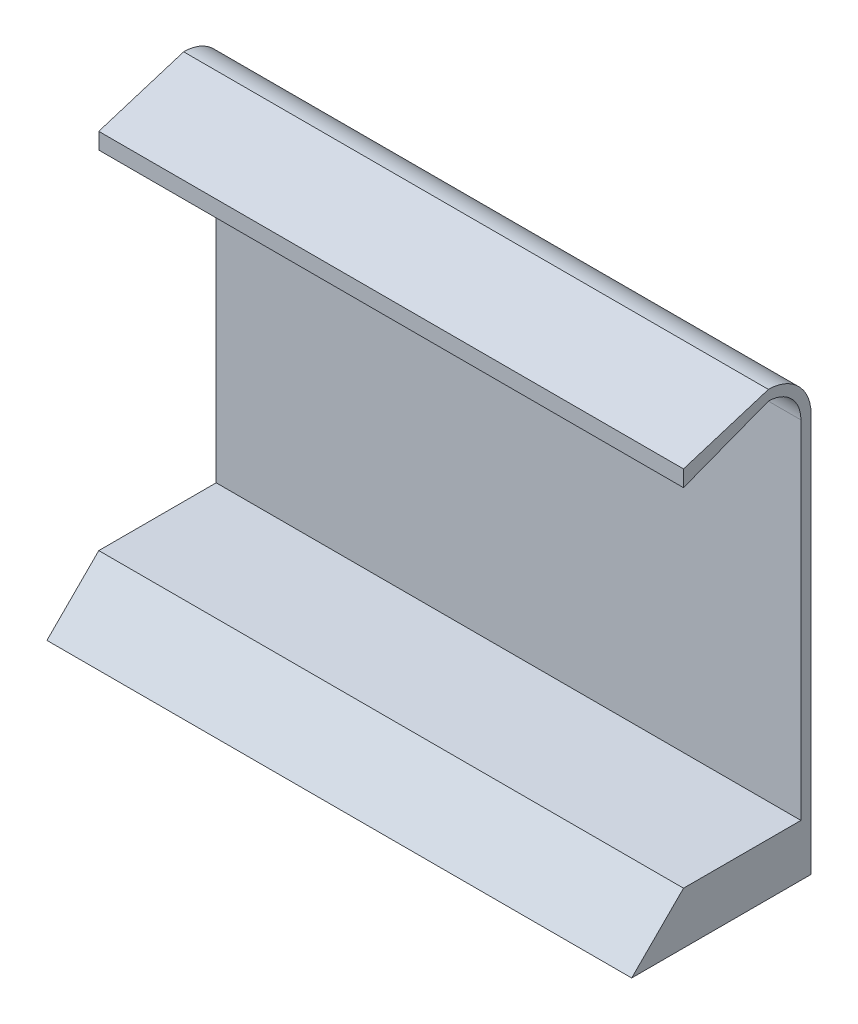
ISO-10303-21;
HEADER;
FILE_DESCRIPTION(('STEP AP214'),'2;1');
FILE_NAME('part.step','',(''),(''),'','','');
FILE_SCHEMA(('AUTOMOTIVE_DESIGN { 1 0 10303 214 1 1 1 1 }'));
ENDSEC;
DATA;
#1=APPLICATION_CONTEXT('core data for automotive mechanical design processes');
#2=APPLICATION_PROTOCOL_DEFINITION('international standard','automotive_design',2000,#1);
#3=PRODUCT_CONTEXT('',#1,'mechanical');
#4=PRODUCT('Part','Part','',(#3));
#5=PRODUCT_RELATED_PRODUCT_CATEGORY('part','',(#4));
#6=PRODUCT_DEFINITION_FORMATION('','',#4);
#7=PRODUCT_DEFINITION_CONTEXT('part definition',#1,'design');
#8=PRODUCT_DEFINITION('design','',#6,#7);
#9=PRODUCT_DEFINITION_SHAPE('','',#8);
#10=(LENGTH_UNIT() NAMED_UNIT(*) SI_UNIT(.MILLI.,.METRE.));
#11=(NAMED_UNIT(*) PLANE_ANGLE_UNIT() SI_UNIT($,.RADIAN.));
#12=(NAMED_UNIT(*) SI_UNIT($,.STERADIAN.) SOLID_ANGLE_UNIT());
#13=UNCERTAINTY_MEASURE_WITH_UNIT(LENGTH_MEASURE(1.E-05),#10,'distance_accuracy_value','');
#14=(GEOMETRIC_REPRESENTATION_CONTEXT(3) GLOBAL_UNCERTAINTY_ASSIGNED_CONTEXT((#13)) GLOBAL_UNIT_ASSIGNED_CONTEXT((#10,
#11,#12)) REPRESENTATION_CONTEXT('',''));
#15=CARTESIAN_POINT('',(0.,0.,0.));
#16=DIRECTION('',(0.,0.,1.));
#17=DIRECTION('',(1.,0.,0.));
#18=AXIS2_PLACEMENT_3D('',#15,#16,#17);
#19=CARTESIAN_POINT('',(558.8,-315.218136756144,1.01656511048225E-13));
#20=DIRECTION('',(0.,-1.,0.));
#21=DIRECTION('',(0.,0.,-1.));
#22=AXIS2_PLACEMENT_3D('',#19,#20,#21);
#23=PLANE('',#22);
#24=DIRECTION('',(0.,0.,1.));
#25=VECTOR('',#24,1.);
#26=CARTESIAN_POINT('',(0.,-315.218136756144,1.01656511048225E-13));
#27=LINE('',#26,#25);
#28=CARTESIAN_POINT('',(0.,-315.218136756144,1.01656511048225E-13));
#29=VERTEX_POINT('',#28);
#30=CARTESIAN_POINT('',(0.,-315.218136756144,112.188138153515));
#31=VERTEX_POINT('',#30);
#32=EDGE_CURVE('E141',#29,#31,#27,.T.);
#33=ORIENTED_EDGE('',*,*,#32,.T.);
#34=DIRECTION('',(-1.,0.,0.));
#35=VECTOR('',#34,1.);
#36=CARTESIAN_POINT('',(558.8,-315.218136756144,112.188138153515));
#37=LINE('',#36,#35);
#38=CARTESIAN_POINT('',(558.8,-315.218136756144,112.188138153515));
#39=VERTEX_POINT('',#38);
#40=EDGE_CURVE('E11',#39,#31,#37,.T.);
#41=ORIENTED_EDGE('',*,*,#40,.F.);
#42=DIRECTION('',(0.,0.,1.));
#43=VECTOR('',#42,1.);
#44=CARTESIAN_POINT('',(558.8,-315.218136756144,1.01656511048225E-13));
#45=LINE('',#44,#43);
#46=CARTESIAN_POINT('',(558.8,-315.218136756144,1.01656511048225E-13));
#47=VERTEX_POINT('',#46);
#48=EDGE_CURVE('E160',#47,#39,#45,.T.);
#49=ORIENTED_EDGE('',*,*,#48,.F.);
#50=DIRECTION('',(-1.,0.,0.));
#51=VECTOR('',#50,1.);
#52=CARTESIAN_POINT('',(558.8,-315.218136756144,1.01656511048225E-13));
#53=LINE('',#52,#51);
#54=EDGE_CURVE('E137',#47,#29,#53,.T.);
#55=ORIENTED_EDGE('',*,*,#54,.T.);
#56=EDGE_LOOP('',(#33,#41,#49,#55));
#57=FACE_BOUND('',#56,.T.);
#58=ADVANCED_FACE('F33',(#57),#23,.F.);
#59=CARTESIAN_POINT('',(558.8,-315.218136756144,112.188138153515));
#60=DIRECTION('',(0.,-0.707106781186548,-0.707106781186548));
#61=DIRECTION('',(0.,0.707106781186548,-0.707106781186548));
#62=AXIS2_PLACEMENT_3D('',#59,#60,#61);
#63=PLANE('',#62);
#64=DIRECTION('',(0.,-0.707106781186547,0.707106781186547));
#65=VECTOR('',#64,1.);
#66=CARTESIAN_POINT('',(0.,-315.218136756144,112.188138153515));
#67=LINE('',#66,#65);
#68=CARTESIAN_POINT('',(0.,-364.768987416644,161.738988814015));
#69=VERTEX_POINT('',#68);
#70=EDGE_CURVE('E144',#31,#69,#67,.T.);
#71=ORIENTED_EDGE('',*,*,#70,.T.);
#72=DIRECTION('',(-1.,0.,0.));
#73=VECTOR('',#72,1.);
#74=CARTESIAN_POINT('',(558.8,-364.768987416644,161.738988814015));
#75=LINE('',#74,#73);
#76=CARTESIAN_POINT('',(558.8,-364.768987416644,161.738988814015));
#77=VERTEX_POINT('',#76);
#78=EDGE_CURVE('E41',#77,#69,#75,.T.);
#79=ORIENTED_EDGE('',*,*,#78,.F.);
#80=DIRECTION('',(0.,-0.707106781186547,0.707106781186547));
#81=VECTOR('',#80,1.);
#82=CARTESIAN_POINT('',(558.8,-315.218136756144,112.188138153515));
#83=LINE('',#82,#81);
#84=EDGE_CURVE('E98',#39,#77,#83,.T.);
#85=ORIENTED_EDGE('',*,*,#84,.F.);
#86=ORIENTED_EDGE('',*,*,#40,.T.);
#87=EDGE_LOOP('',(#71,#79,#85,#86));
#88=FACE_BOUND('',#87,.T.);
#89=ADVANCED_FACE('F181',(#88),#63,.F.);
#90=CARTESIAN_POINT('',(558.8,-364.768987416644,1.32675666207716E-13));
#91=DIRECTION('',(0.,1.,0.));
#92=DIRECTION('',(0.,0.,1.));
#93=AXIS2_PLACEMENT_3D('',#90,#91,#92);
#94=PLANE('',#93);
#95=DIRECTION('',(0.,0.,-1.));
#96=VECTOR('',#95,1.);
#97=CARTESIAN_POINT('',(0.,-364.768987416644,1.32675666207716E-13));
#98=LINE('',#97,#96);
#99=CARTESIAN_POINT('',(0.,-364.768987416644,-9.7108622293583));
#100=VERTEX_POINT('',#99);
#101=EDGE_CURVE('E147',#69,#100,#98,.T.);
#102=ORIENTED_EDGE('',*,*,#101,.T.);
#103=DIRECTION('',(-1.,0.,0.));
#104=VECTOR('',#103,1.);
#105=CARTESIAN_POINT('',(558.8,-364.768987416644,-9.7108622293583));
#106=LINE('',#105,#104);
#107=CARTESIAN_POINT('',(558.8,-364.768987416644,-9.7108622293583));
#108=VERTEX_POINT('',#107);
#109=EDGE_CURVE('E173',#108,#100,#106,.T.);
#110=ORIENTED_EDGE('',*,*,#109,.F.);
#111=DIRECTION('',(0.,0.,-1.));
#112=VECTOR('',#111,1.);
#113=CARTESIAN_POINT('',(558.8,-364.768987416644,161.738988814015));
#114=LINE('',#113,#112);
#115=EDGE_CURVE('E180',#77,#108,#114,.T.);
#116=ORIENTED_EDGE('',*,*,#115,.F.);
#117=ORIENTED_EDGE('',*,*,#78,.T.);
#118=EDGE_LOOP('',(#102,#110,#116,#117));
#119=FACE_BOUND('',#118,.T.);
#120=ADVANCED_FACE('F178',(#119),#94,.F.);
#121=CARTESIAN_POINT('',(558.8,-364.768987416644,-9.7108622293583));
#122=DIRECTION('',(0.,0.,1.));
#123=DIRECTION('',(0.,-1.,0.));
#124=AXIS2_PLACEMENT_3D('',#121,#122,#123);
#125=PLANE('',#124);
#126=DIRECTION('',(0.,1.,0.));
#127=VECTOR('',#126,1.);
#128=CARTESIAN_POINT('',(0.,-364.768987416644,-9.7108622293583));
#129=LINE('',#128,#127);
#130=CARTESIAN_POINT('',(0.,16.2310125833563,-9.71086222935846));
#131=VERTEX_POINT('',#130);
#132=EDGE_CURVE('E149',#100,#131,#129,.T.);
#133=ORIENTED_EDGE('',*,*,#132,.T.);
#134=DIRECTION('',(-1.,0.,0.));
#135=VECTOR('',#134,1.);
#136=CARTESIAN_POINT('',(558.8,16.2310125833563,-9.71086222935846));
#137=LINE('',#136,#135);
#138=CARTESIAN_POINT('',(558.8,16.2310125833563,-9.71086222935846));
#139=VERTEX_POINT('',#138);
#140=EDGE_CURVE('E170',#139,#131,#137,.T.);
#141=ORIENTED_EDGE('',*,*,#140,.F.);
#142=DIRECTION('',(0.,1.,0.));
#143=VECTOR('',#142,1.);
#144=CARTESIAN_POINT('',(558.8,-364.768987416644,-9.7108622293583));
#145=LINE('',#144,#143);
#146=EDGE_CURVE('E200',#108,#139,#145,.T.);
#147=ORIENTED_EDGE('',*,*,#146,.F.);
#148=ORIENTED_EDGE('',*,*,#109,.T.);
#149=EDGE_LOOP('',(#133,#141,#147,#148));
#150=FACE_BOUND('',#149,.T.);
#151=ADVANCED_FACE('F191',(#150),#125,.F.);
#152=CARTESIAN_POINT('',(558.8,16.2310125833563,31.074759133947));
#153=DIRECTION('',(-1.,0.,0.));
#154=DIRECTION('',(0.,0.,1.));
#155=AXIS2_PLACEMENT_3D('',#152,#153,#154);
#156=CYLINDRICAL_SURFACE('',#155,40.7856213633055);
#157=CARTESIAN_POINT('',(0.,16.2310125833563,31.074759133947));
#158=DIRECTION('',(1.,0.,0.));
#159=DIRECTION('',(0.,0.,-1.));
#160=AXIS2_PLACEMENT_3D('',#157,#158,#159);
#161=CIRCLE('',#160,40.7856213633055);
#162=CARTESIAN_POINT('',(0.,57.0166339466617,31.0747591339472));
#163=VERTEX_POINT('',#162);
#164=EDGE_CURVE('E151',#131,#163,#161,.T.);
#165=ORIENTED_EDGE('',*,*,#164,.T.);
#166=DIRECTION('',(-1.,0.,0.));
#167=VECTOR('',#166,1.);
#168=CARTESIAN_POINT('',(558.8,57.0166339466617,31.0747591339472));
#169=LINE('',#168,#167);
#170=CARTESIAN_POINT('',(558.8,57.0166339466617,31.0747591339472));
#171=VERTEX_POINT('',#170);
#172=EDGE_CURVE('E167',#171,#163,#169,.T.);
#173=ORIENTED_EDGE('',*,*,#172,.F.);
#174=CARTESIAN_POINT('',(558.8,16.2310125833563,31.074759133947));
#175=DIRECTION('',(1.,0.,0.));
#176=DIRECTION('',(0.,0.,-1.));
#177=AXIS2_PLACEMENT_3D('',#174,#175,#176);
#178=CIRCLE('',#177,40.7856213633055);
#179=EDGE_CURVE('E197',#139,#171,#178,.T.);
#180=ORIENTED_EDGE('',*,*,#179,.F.);
#181=ORIENTED_EDGE('',*,*,#140,.T.);
#182=EDGE_LOOP('',(#165,#173,#180,#181));
#183=FACE_BOUND('',#182,.T.);
#184=ADVANCED_FACE('F195',(#183),#156,.T.);
#185=CARTESIAN_POINT('',(558.8,31.76839215033,112.188138153515));
#186=DIRECTION('',(0.,-0.954813464793643,-0.29720573253011));
#187=DIRECTION('',(0.,0.29720573253011,-0.954813464793643));
#188=AXIS2_PLACEMENT_3D('',#185,#186,#187);
#189=PLANE('',#188);
#190=DIRECTION('',(0.,-0.29720573253011,0.954813464793643));
#191=VECTOR('',#190,1.);
#192=CARTESIAN_POINT('',(0.,31.76839215033,112.188138153515));
#193=LINE('',#192,#191);
#194=CARTESIAN_POINT('',(0.,31.76839215033,112.188138153515));
#195=VERTEX_POINT('',#194);
#196=EDGE_CURVE('E153',#163,#195,#193,.T.);
#197=ORIENTED_EDGE('',*,*,#196,.T.);
#198=DIRECTION('',(-1.,0.,0.));
#199=VECTOR('',#198,1.);
#200=CARTESIAN_POINT('',(558.8,31.76839215033,112.188138153515));
#201=LINE('',#200,#199);
#202=CARTESIAN_POINT('',(558.8,31.76839215033,112.188138153515));
#203=VERTEX_POINT('',#202);
#204=EDGE_CURVE('E164',#203,#195,#201,.T.);
#205=ORIENTED_EDGE('',*,*,#204,.F.);
#206=DIRECTION('',(0.,-0.29720573253011,0.954813464793643));
#207=VECTOR('',#206,1.);
#208=CARTESIAN_POINT('',(558.8,31.76839215033,112.188138153515));
#209=LINE('',#208,#207);
#210=EDGE_CURVE('E199',#171,#203,#209,.T.);
#211=ORIENTED_EDGE('',*,*,#210,.F.);
#212=ORIENTED_EDGE('',*,*,#172,.T.);
#213=EDGE_LOOP('',(#197,#205,#211,#212));
#214=FACE_BOUND('',#213,.T.);
#215=ADVANCED_FACE('F215',(#214),#189,.F.);
#216=CARTESIAN_POINT('',(558.8,16.2310125833563,112.188138153515));
#217=DIRECTION('',(0.,0.,-1.));
#218=DIRECTION('',(0.,1.,0.));
#219=AXIS2_PLACEMENT_3D('',#216,#217,#218);
#220=PLANE('',#219);
#221=DIRECTION('',(0.,-1.,0.));
#222=VECTOR('',#221,1.);
#223=CARTESIAN_POINT('',(0.,16.2310125833563,112.188138153515));
#224=LINE('',#223,#222);
#225=CARTESIAN_POINT('',(0.,16.2310125833563,112.188138153515));
#226=VERTEX_POINT('',#225);
#227=EDGE_CURVE('E155',#195,#226,#224,.T.);
#228=ORIENTED_EDGE('',*,*,#227,.T.);
#229=DIRECTION('',(-1.,0.,0.));
#230=VECTOR('',#229,1.);
#231=CARTESIAN_POINT('',(558.8,16.2310125833563,112.188138153515));
#232=LINE('',#231,#230);
#233=CARTESIAN_POINT('',(558.8,16.2310125833563,112.188138153515));
#234=VERTEX_POINT('',#233);
#235=EDGE_CURVE('E132',#234,#226,#232,.T.);
#236=ORIENTED_EDGE('',*,*,#235,.F.);
#237=DIRECTION('',(0.,-1.,0.));
#238=VECTOR('',#237,1.);
#239=CARTESIAN_POINT('',(558.8,16.2310125833563,112.188138153515));
#240=LINE('',#239,#238);
#241=EDGE_CURVE('E123',#203,#234,#240,.T.);
#242=ORIENTED_EDGE('',*,*,#241,.F.);
#243=ORIENTED_EDGE('',*,*,#204,.T.);
#244=EDGE_LOOP('',(#228,#236,#242,#243));
#245=FACE_BOUND('',#244,.T.);
#246=ADVANCED_FACE('F212',(#245),#220,.F.);
#247=CARTESIAN_POINT('',(558.8,47.3057717173033,31.0747591339471));
#248=DIRECTION('',(0.,0.933818061744606,0.357748274013372));
#249=DIRECTION('',(0.,-0.357748274013372,0.933818061744606));
#250=AXIS2_PLACEMENT_3D('',#247,#248,#249);
#251=PLANE('',#250);
#252=DIRECTION('',(0.,0.357748274013372,-0.933818061744606));
#253=VECTOR('',#252,1.);
#254=CARTESIAN_POINT('',(0.,47.3057717173033,31.0747591339471));
#255=LINE('',#254,#253);
#256=CARTESIAN_POINT('',(0.,47.3057717173033,31.0747591339471));
#257=VERTEX_POINT('',#256);
#258=EDGE_CURVE('E131',#226,#257,#255,.T.);
#259=ORIENTED_EDGE('',*,*,#258,.T.);
#260=DIRECTION('',(-1.,0.,0.));
#261=VECTOR('',#260,1.);
#262=CARTESIAN_POINT('',(558.8,47.3057717173033,31.0747591339471));
#263=LINE('',#262,#261);
#264=CARTESIAN_POINT('',(558.8,47.3057717173033,31.0747591339471));
#265=VERTEX_POINT('',#264);
#266=EDGE_CURVE('E128',#265,#257,#263,.T.);
#267=ORIENTED_EDGE('',*,*,#266,.F.);
#268=DIRECTION('',(0.,0.357748274013372,-0.933818061744606));
#269=VECTOR('',#268,1.);
#270=CARTESIAN_POINT('',(558.8,47.3057717173033,31.0747591339471));
#271=LINE('',#270,#269);
#272=EDGE_CURVE('E117',#234,#265,#271,.T.);
#273=ORIENTED_EDGE('',*,*,#272,.F.);
#274=ORIENTED_EDGE('',*,*,#235,.T.);
#275=EDGE_LOOP('',(#259,#267,#273,#274));
#276=FACE_BOUND('',#275,.T.);
#277=ADVANCED_FACE('F129',(#276),#251,.F.);
#278=CARTESIAN_POINT('',(558.8,16.2310125833563,31.074759133947));
#279=DIRECTION('',(-1.,0.,0.));
#280=DIRECTION('',(0.,0.,1.));
#281=AXIS2_PLACEMENT_3D('',#278,#279,#280);
#282=CYLINDRICAL_SURFACE('',#281,31.074759133947);
#283=CARTESIAN_POINT('',(0.,16.2310125833563,31.074759133947));
#284=DIRECTION('',(-1.,0.,0.));
#285=DIRECTION('',(0.,0.,-1.));
#286=AXIS2_PLACEMENT_3D('',#283,#284,#285);
#287=CIRCLE('',#286,31.074759133947);
#288=CARTESIAN_POINT('',(0.,16.2310125833563,0.));
#289=VERTEX_POINT('',#288);
#290=EDGE_CURVE('E84',#257,#289,#287,.T.);
#291=ORIENTED_EDGE('',*,*,#290,.T.);
#292=DIRECTION('',(-1.,0.,0.));
#293=VECTOR('',#292,1.);
#294=CARTESIAN_POINT('',(558.8,16.2310125833563,0.));
#295=LINE('',#294,#293);
#296=CARTESIAN_POINT('',(558.8,16.2310125833563,0.));
#297=VERTEX_POINT('',#296);
#298=EDGE_CURVE('E133',#297,#289,#295,.T.);
#299=ORIENTED_EDGE('',*,*,#298,.F.);
#300=CARTESIAN_POINT('',(558.8,16.2310125833563,31.074759133947));
#301=DIRECTION('',(-1.,0.,0.));
#302=DIRECTION('',(0.,0.,-1.));
#303=AXIS2_PLACEMENT_3D('',#300,#301,#302);
#304=CIRCLE('',#303,31.074759133947);
#305=EDGE_CURVE('E121',#265,#297,#304,.T.);
#306=ORIENTED_EDGE('',*,*,#305,.F.);
#307=ORIENTED_EDGE('',*,*,#266,.T.);
#308=EDGE_LOOP('',(#291,#299,#306,#307));
#309=FACE_BOUND('',#308,.T.);
#310=ADVANCED_FACE('F135',(#309),#282,.F.);
#311=CARTESIAN_POINT('',(558.8,16.2310125833563,0.));
#312=DIRECTION('',(0.,0.,-1.));
#313=DIRECTION('',(0.,1.,0.));
#314=AXIS2_PLACEMENT_3D('',#311,#312,#313);
#315=PLANE('',#314);
#316=DIRECTION('',(0.,-1.,0.));
#317=VECTOR('',#316,1.);
#318=CARTESIAN_POINT('',(0.,16.2310125833563,0.));
#319=LINE('',#318,#317);
#320=EDGE_CURVE('E90',#289,#29,#319,.T.);
#321=ORIENTED_EDGE('',*,*,#320,.T.);
#322=ORIENTED_EDGE('',*,*,#54,.F.);
#323=DIRECTION('',(0.,-1.,0.));
#324=VECTOR('',#323,1.);
#325=CARTESIAN_POINT('',(558.8,16.2310125833563,0.));
#326=LINE('',#325,#324);
#327=EDGE_CURVE('E49',#297,#47,#326,.T.);
#328=ORIENTED_EDGE('',*,*,#327,.F.);
#329=ORIENTED_EDGE('',*,*,#298,.T.);
#330=EDGE_LOOP('',(#321,#322,#328,#329));
#331=FACE_BOUND('',#330,.T.);
#332=ADVANCED_FACE('F209',(#331),#315,.F.);
#333=CARTESIAN_POINT('',(558.8,16.2310125833563,31.074759133947));
#334=DIRECTION('',(1.,0.,0.));
#335=DIRECTION('',(0.,0.,-1.));
#336=AXIS2_PLACEMENT_3D('',#333,#334,#335);
#337=PLANE('',#336);
#338=ORIENTED_EDGE('',*,*,#48,.T.);
#339=ORIENTED_EDGE('',*,*,#84,.T.);
#340=ORIENTED_EDGE('',*,*,#115,.T.);
#341=ORIENTED_EDGE('',*,*,#146,.T.);
#342=ORIENTED_EDGE('',*,*,#179,.T.);
#343=ORIENTED_EDGE('',*,*,#210,.T.);
#344=ORIENTED_EDGE('',*,*,#241,.T.);
#345=ORIENTED_EDGE('',*,*,#272,.T.);
#346=ORIENTED_EDGE('',*,*,#305,.T.);
#347=ORIENTED_EDGE('',*,*,#327,.T.);
#348=EDGE_LOOP('',(#338,#339,#340,#341,#342,#343,#344,#345,#346,#347));
#349=FACE_BOUND('',#348,.T.);
#350=ADVANCED_FACE('F119',(#349),#337,.T.);
#351=CARTESIAN_POINT('',(0.,16.2310125833563,31.074759133947));
#352=DIRECTION('',(1.,0.,0.));
#353=DIRECTION('',(0.,0.,-1.));
#354=AXIS2_PLACEMENT_3D('',#351,#352,#353);
#355=PLANE('',#354);
#356=ORIENTED_EDGE('',*,*,#32,.F.);
#357=ORIENTED_EDGE('',*,*,#320,.F.);
#358=ORIENTED_EDGE('',*,*,#290,.F.);
#359=ORIENTED_EDGE('',*,*,#258,.F.);
#360=ORIENTED_EDGE('',*,*,#227,.F.);
#361=ORIENTED_EDGE('',*,*,#196,.F.);
#362=ORIENTED_EDGE('',*,*,#164,.F.);
#363=ORIENTED_EDGE('',*,*,#132,.F.);
#364=ORIENTED_EDGE('',*,*,#101,.F.);
#365=ORIENTED_EDGE('',*,*,#70,.F.);
#366=EDGE_LOOP('',(#356,#357,#358,#359,#360,#361,#362,#363,#364,#365));
#367=FACE_BOUND('',#366,.T.);
#368=ADVANCED_FACE('F185',(#367),#355,.F.);
#369=CLOSED_SHELL('',(#58,#89,#120,#151,#184,#215,#246,#277,#310,#332,#350,#368));
#370=MANIFOLD_SOLID_BREP('B2',#369);
#371=ADVANCED_BREP_SHAPE_REPRESENTATION('',(#18,#370),#14);
#372=SHAPE_DEFINITION_REPRESENTATION(#9,#371);
ENDSEC;
END-ISO-10303-21;
